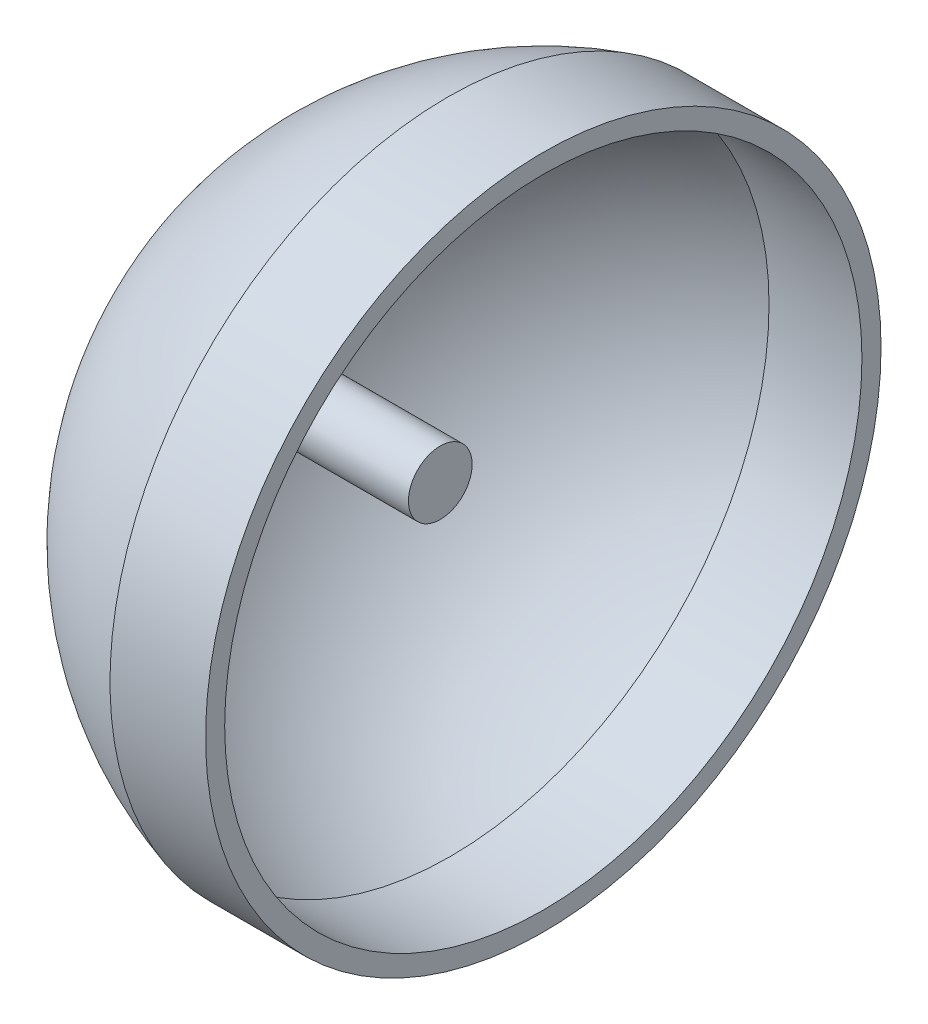
ISO-10303-21;
HEADER;
FILE_DESCRIPTION(('STEP AP214'),'2;1');
FILE_NAME('part.step','',(''),(''),'','','');
FILE_SCHEMA(('AUTOMOTIVE_DESIGN { 1 0 10303 214 1 1 1 1 }'));
ENDSEC;
DATA;
#1=APPLICATION_CONTEXT('core data for automotive mechanical design processes');
#2=APPLICATION_PROTOCOL_DEFINITION('international standard','automotive_design',2000,#1);
#3=PRODUCT_CONTEXT('',#1,'mechanical');
#4=PRODUCT('Part','Part','',(#3));
#5=PRODUCT_RELATED_PRODUCT_CATEGORY('part','',(#4));
#6=PRODUCT_DEFINITION_FORMATION('','',#4);
#7=PRODUCT_DEFINITION_CONTEXT('part definition',#1,'design');
#8=PRODUCT_DEFINITION('design','',#6,#7);
#9=PRODUCT_DEFINITION_SHAPE('','',#8);
#10=(LENGTH_UNIT() NAMED_UNIT(*) SI_UNIT(.MILLI.,.METRE.));
#11=(NAMED_UNIT(*) PLANE_ANGLE_UNIT() SI_UNIT($,.RADIAN.));
#12=(NAMED_UNIT(*) SI_UNIT($,.STERADIAN.) SOLID_ANGLE_UNIT());
#13=UNCERTAINTY_MEASURE_WITH_UNIT(LENGTH_MEASURE(1.E-05),#10,'distance_accuracy_value','');
#14=(GEOMETRIC_REPRESENTATION_CONTEXT(3) GLOBAL_UNCERTAINTY_ASSIGNED_CONTEXT((#13)) GLOBAL_UNIT_ASSIGNED_CONTEXT((#10,
#11,#12)) REPRESENTATION_CONTEXT('',''));
#15=CARTESIAN_POINT('',(0.,0.,0.));
#16=DIRECTION('',(0.,0.,1.));
#17=DIRECTION('',(1.,0.,0.));
#18=AXIS2_PLACEMENT_3D('',#15,#16,#17);
#19=CARTESIAN_POINT('',(0.,0.,0.));
#20=DIRECTION('',(1.,0.,0.));
#21=DIRECTION('',(0.,0.,-1.));
#22=AXIS2_PLACEMENT_3D('',#19,#20,#21);
#23=PLANE('',#22);
#24=CARTESIAN_POINT('',(0.,0.,0.));
#25=DIRECTION('',(1.,0.,0.));
#26=DIRECTION('',(0.,0.,-1.));
#27=AXIS2_PLACEMENT_3D('',#24,#25,#26);
#28=CIRCLE('',#27,50.);
#29=CARTESIAN_POINT('',(0.,0.,-50.));
#30=VERTEX_POINT('',#29);
#31=EDGE_CURVE('E58',#30,#30,#28,.T.);
#32=ORIENTED_EDGE('',*,*,#31,.F.);
#33=EDGE_LOOP('',(#32));
#34=FACE_BOUND('',#33,.T.);
#35=CARTESIAN_POINT('',(0.,0.,0.));
#36=DIRECTION('',(1.,0.,0.));
#37=DIRECTION('',(0.,0.,-1.));
#38=AXIS2_PLACEMENT_3D('',#35,#36,#37);
#39=CIRCLE('',#38,53.);
#40=CARTESIAN_POINT('',(0.,0.,-53.));
#41=VERTEX_POINT('',#40);
#42=EDGE_CURVE('E40',#41,#41,#39,.T.);
#43=ORIENTED_EDGE('',*,*,#42,.T.);
#44=EDGE_LOOP('',(#43));
#45=FACE_BOUND('',#44,.T.);
#46=ADVANCED_FACE('F37',(#34,#45),#23,.T.);
#47=CARTESIAN_POINT('',(0.,0.,0.));
#48=DIRECTION('',(1.,0.,0.));
#49=DIRECTION('',(0.,0.,-1.));
#50=AXIS2_PLACEMENT_3D('',#47,#48,#49);
#51=CYLINDRICAL_SURFACE('',#50,53.);
#52=CARTESIAN_POINT('',(-15.,0.,0.));
#53=DIRECTION('',(1.,0.,0.));
#54=DIRECTION('',(0.,0.,-1.));
#55=AXIS2_PLACEMENT_3D('',#52,#53,#54);
#56=CIRCLE('',#55,53.);
#57=CARTESIAN_POINT('',(-15.,53.,0.));
#58=VERTEX_POINT('',#57);
#59=EDGE_CURVE('E50',#58,#58,#56,.T.);
#60=ORIENTED_EDGE('',*,*,#59,.T.);
#61=EDGE_LOOP('',(#60));
#62=FACE_BOUND('',#61,.T.);
#63=ORIENTED_EDGE('',*,*,#42,.F.);
#64=EDGE_LOOP('',(#63));
#65=FACE_BOUND('',#64,.T.);
#66=ADVANCED_FACE('F81',(#62,#65),#51,.T.);
#67=CARTESIAN_POINT('',(0.,0.,0.));
#68=DIRECTION('',(1.,0.,0.));
#69=DIRECTION('',(0.,1.,0.));
#70=AXIS2_PLACEMENT_3D('',#67,#68,#69);
#71=SPHERICAL_SURFACE('',#70,55.0817574156816);
#72=CARTESIAN_POINT('',(-54.1664102558034,0.,0.));
#73=DIRECTION('',(1.,0.,0.));
#74=DIRECTION('',(0.,0.,-1.));
#75=AXIS2_PLACEMENT_3D('',#72,#73,#74);
#76=CIRCLE('',#75,10.);
#77=CARTESIAN_POINT('',(-54.1664102558034,10.,0.));
#78=VERTEX_POINT('',#77);
#79=EDGE_CURVE('E74',#78,#78,#76,.T.);
#80=CARTESIAN_POINT('',(-54.1664102558034,10.,0.));
#81=CARTESIAN_POINT('',(-54.0505368614668,10.6276710865457,0.));
#82=CARTESIAN_POINT('',(-53.9237442432761,11.2533260120857,0.));
#83=CARTESIAN_POINT('',(-53.6484944188,12.4998520748426,0.));
#84=CARTESIAN_POINT('',(-53.5000372125146,13.1207232120596,0.));
#85=CARTESIAN_POINT('',(-53.1816320714627,14.3569302318588,0.));
#86=CARTESIAN_POINT('',(-53.0116841366961,14.9722661144411,0.));
#87=CARTESIAN_POINT('',(-52.6505043817629,16.1966593962277,0.));
#88=CARTESIAN_POINT('',(-52.4592725615962,16.8057167954321,0.));
#89=CARTESIAN_POINT('',(-52.0557557182811,18.0168170534486,0.));
#90=CARTESIAN_POINT('',(-51.8434706951328,18.6188599122608,0.));
#91=CARTESIAN_POINT('',(-51.3981040720495,19.8152036198758,0.));
#92=CARTESIAN_POINT('',(-51.1650224721146,20.4095044686786,0.));
#93=CARTESIAN_POINT('',(-50.6783443167559,21.5896460121059,0.));
#94=CARTESIAN_POINT('',(-50.4247477613321,22.1754867067303,0.));
#95=CARTESIAN_POINT('',(-49.8973461421968,23.3380000286488,0.));
#96=CARTESIAN_POINT('',(-49.6235410784854,23.914672655943,0.));
#97=CARTESIAN_POINT('',(-49.0560532997295,25.0581530063667,0.));
#98=CARTESIAN_POINT('',(-48.7623705846851,25.6249607294963,0.));
#99=CARTESIAN_POINT('',(-48.1554823824572,26.7480263558265,0.));
#100=CARTESIAN_POINT('',(-47.8422768952736,27.304284259027,0.));
#101=CARTESIAN_POINT('',(-47.1967216180815,28.4055780777125,0.));
#102=CARTESIAN_POINT('',(-46.8643718280731,28.9506139931974,0.));
#103=CARTESIAN_POINT('',(-46.1809295482153,30.0288052290674,0.));
#104=CARTESIAN_POINT('',(-45.8298370583661,30.5619605494526,0.));
#105=CARTESIAN_POINT('',(-45.1093336299579,31.6157463439339,0.));
#106=CARTESIAN_POINT('',(-44.7399226913989,32.13637681803,0.));
#107=CARTESIAN_POINT('',(-43.9832287522583,33.1644838034493,0.));
#108=CARTESIAN_POINT('',(-43.5959457516766,33.6719603147725,0.));
#109=CARTESIAN_POINT('',(-42.8039756713145,34.6731461530717,0.));
#110=CARTESIAN_POINT('',(-42.399288591534,35.1668554800478,0.));
#111=CARTESIAN_POINT('',(-41.5729993662411,36.1399103639904,0.));
#112=CARTESIAN_POINT('',(-41.1513972207287,36.6192559209571,0.));
#113=CARTESIAN_POINT('',(-40.2917873171692,37.5630040360292,0.));
#114=CARTESIAN_POINT('',(-39.8537795591222,38.0274065941347,0.));
#115=CARTESIAN_POINT('',(-38.9618877078114,38.9407075393687,0.));
#116=CARTESIAN_POINT('',(-38.5080036145476,39.3896059264971,0.));
#117=CARTESIAN_POINT('',(-37.5849075546768,40.2713560925026,0.));
#118=CARTESIAN_POINT('',(-37.1156955880697,40.7042078713796,0.));
#119=CARTESIAN_POINT('',(-36.1625107651939,41.5533417739176,0.));
#120=CARTESIAN_POINT('',(-35.6785379089252,41.9696238975786,0.));
#121=CARTESIAN_POINT('',(-34.6964161270868,42.7851154650623,0.));
#122=CARTESIAN_POINT('',(-34.198267201517,43.1843249088849,0.));
#123=CARTESIAN_POINT('',(-33.1883952314387,43.96518872227,0.));
#124=CARTESIAN_POINT('',(-32.6766721869302,44.3468430918325,0.));
#125=CARTESIAN_POINT('',(-31.6402703319378,45.0921355753271,0.));
#126=CARTESIAN_POINT('',(-31.1155915214539,45.4557736892593,0.));
#127=CARTESIAN_POINT('',(-30.0539121429468,46.1645942506856,0.));
#128=CARTESIAN_POINT('',(-29.5169115749236,46.5097766981796,0.));
#129=CARTESIAN_POINT('',(-28.4312375788517,47.1812688165963,0.));
#130=CARTESIAN_POINT('',(-27.882564150803,47.5075784875189,0.));
#131=CARTESIAN_POINT('',(-26.7742074381902,48.1409307505691,0.));
#132=CARTESIAN_POINT('',(-26.2145241536262,48.4479733426967,0.));
#133=CARTESIAN_POINT('',(-25.0848240324884,49.0424204183287,0.));
#134=CARTESIAN_POINT('',(-24.5148071959146,49.329824901833,0.));
#135=CARTESIAN_POINT('',(-23.365128773378,49.8846484958343,0.));
#136=CARTESIAN_POINT('',(-22.7854671874153,50.1520676063312,0.));
#137=CARTESIAN_POINT('',(-21.6171996809555,50.6665972081588,0.));
#138=CARTESIAN_POINT('',(-21.0285937604584,50.9137076994895,0.));
#139=CARTESIAN_POINT('',(-19.8431489655053,51.3873218483241,0.));
#140=CARTESIAN_POINT('',(-19.2463100910492,51.6138255058281,0.));
#141=CARTESIAN_POINT('',(-18.0451201290106,52.0459508403632,0.));
#142=CARTESIAN_POINT('',(-17.4407690414282,52.2515725173944,0.));
#143=CARTESIAN_POINT('',(-16.225286666848,52.6416908175178,0.));
#144=CARTESIAN_POINT('',(-15.6141553798501,52.8261874406101,0.));
#145=CARTESIAN_POINT('',(-15.,53.,0.));
#146=B_SPLINE_CURVE_WITH_KNOTS('',3,(#80,#81,#82,#83,#84,#85,#86,#87,#88,#89,#90,#91,#92,#93,
#94,#95,#96,#97,#98,#99,#100,#101,#102,#103,#104,#105,#106,#107,#108,#109,#110,#111,#112,#113,
#114,#115,#116,#117,#118,#119,#120,#121,#122,#123,#124,#125,#126,#127,#128,#129,#130,#131,#132,
#133,#134,#135,#136,#137,#138,#139,#140,#141,#142,#143,#144,#145),.UNSPECIFIED.,.F.,.F.,(4,2,2,
2,2,2,2,2,2,2,2,2,2,2,2,2,2,2,2,2,2,2,2,2,2,2,2,2,2,2,2,2,4),(0.,1.91473434854773,
3.82946869709545,5.74420304564319,7.65893739419092,9.57367174273864,11.4884060912864,
13.4031404398341,15.3178747883818,17.2326091369296,19.1473434854773,21.062077834025,
22.9768121825727,24.8915465311205,26.8062808796682,28.7210152282159,30.6357495767637,
32.5504839253114,34.4652182738591,36.3799526224068,38.2946869709546,40.2094213195023,
42.12415566805,44.0388900165977,45.9536243651455,47.8683587136932,49.7830930622409,
51.6978274107887,53.6125617593364,55.5272961078841,57.4420304564319,59.3567648049796,
61.2714991535273),.UNSPECIFIED.);
#147=EDGE_CURVE('BSEAM84',#78,#58,#146,.T.);
#148=ORIENTED_EDGE('',*,*,#79,.T.);
#149=ORIENTED_EDGE('',*,*,#59,.F.);
#150=ORIENTED_EDGE('',*,*,#147,.T.);
#151=ORIENTED_EDGE('',*,*,#147,.F.);
#152=EDGE_LOOP('',(#148,#150,#149,#151));
#153=FACE_BOUND('',#152,.T.);
#154=ADVANCED_FACE('F84',(#153),#71,.T.);
#155=CARTESIAN_POINT('',(0.,0.,0.));
#156=DIRECTION('',(1.,0.,0.));
#157=DIRECTION('',(0.,0.,-1.));
#158=AXIS2_PLACEMENT_3D('',#155,#156,#157);
#159=CYLINDRICAL_SURFACE('',#158,10.);
#160=CARTESIAN_POINT('',(-49.1664102558034,0.,0.));
#161=DIRECTION('',(1.,0.,0.));
#162=DIRECTION('',(0.,0.,-1.));
#163=AXIS2_PLACEMENT_3D('',#160,#161,#162);
#164=CIRCLE('',#163,9.99999999999999);
#165=CARTESIAN_POINT('',(-49.1664102558034,0.,-9.99999999999999));
#166=VERTEX_POINT('',#165);
#167=EDGE_CURVE('E70',#166,#166,#164,.T.);
#168=ORIENTED_EDGE('',*,*,#167,.T.);
#169=EDGE_LOOP('',(#168));
#170=FACE_BOUND('',#169,.T.);
#171=ORIENTED_EDGE('',*,*,#79,.F.);
#172=EDGE_LOOP('',(#171));
#173=FACE_BOUND('',#172,.T.);
#174=ADVANCED_FACE('F86',(#170,#173),#159,.F.);
#175=CARTESIAN_POINT('',(-49.1664102558034,0.,0.));
#176=DIRECTION('',(-1.,0.,0.));
#177=DIRECTION('',(0.,0.,1.));
#178=AXIS2_PLACEMENT_3D('',#175,#176,#177);
#179=PLANE('',#178);
#180=ORIENTED_EDGE('',*,*,#167,.F.);
#181=EDGE_LOOP('',(#180));
#182=FACE_BOUND('',#181,.T.);
#183=ADVANCED_FACE('F93',(#182),#179,.T.);
#184=CARTESIAN_POINT('',(0.,0.,0.));
#185=DIRECTION('',(1.,0.,0.));
#186=DIRECTION('',(0.,0.,-1.));
#187=AXIS2_PLACEMENT_3D('',#184,#185,#186);
#188=CYLINDRICAL_SURFACE('',#187,50.);
#189=CARTESIAN_POINT('',(-14.5777040546826,0.,0.));
#190=DIRECTION('',(1.,0.,0.));
#191=DIRECTION('',(0.,0.,-1.));
#192=AXIS2_PLACEMENT_3D('',#189,#190,#191);
#193=CIRCLE('',#192,50.);
#194=CARTESIAN_POINT('',(-14.5777040546826,50.,0.));
#195=VERTEX_POINT('',#194);
#196=EDGE_CURVE('E54',#195,#195,#193,.T.);
#197=ORIENTED_EDGE('',*,*,#196,.F.);
#198=EDGE_LOOP('',(#197));
#199=FACE_BOUND('',#198,.T.);
#200=ORIENTED_EDGE('',*,*,#31,.T.);
#201=EDGE_LOOP('',(#200));
#202=FACE_BOUND('',#201,.T.);
#203=ADVANCED_FACE('F104',(#199,#202),#188,.F.);
#204=CARTESIAN_POINT('',(0.,0.,0.));
#205=DIRECTION('',(1.,0.,0.));
#206=DIRECTION('',(0.,1.,0.));
#207=AXIS2_PLACEMENT_3D('',#204,#205,#206);
#208=SPHERICAL_SURFACE('',#207,52.0817574156816);
#209=CARTESIAN_POINT('',(-50.4332177786219,0.,0.));
#210=DIRECTION('',(1.,0.,0.));
#211=DIRECTION('',(0.,0.,-1.));
#212=AXIS2_PLACEMENT_3D('',#209,#210,#211);
#213=CIRCLE('',#212,13.);
#214=CARTESIAN_POINT('',(-50.4332177786219,13.,0.));
#215=VERTEX_POINT('',#214);
#216=EDGE_CURVE('E59',#215,#215,#213,.T.);
#217=CARTESIAN_POINT('',(-50.4332177786219,13.,0.));
#218=CARTESIAN_POINT('',(-50.2930876840259,13.5436453108094,0.));
#219=CARTESIAN_POINT('',(-50.1441608428461,14.0850229168382,0.));
#220=CARTESIAN_POINT('',(-49.8288837671326,15.1626808124265,0.));
#221=CARTESIAN_POINT('',(-49.6625335325988,15.698961101986,0.));
#222=CARTESIAN_POINT('',(-49.3125797699902,16.7658624577274,0.));
#223=CARTESIAN_POINT('',(-49.1289762419154,17.2964835239094,0.));
#224=CARTESIAN_POINT('',(-48.7447089154272,18.3515118719753,0.));
#225=CARTESIAN_POINT('',(-48.5440451170137,18.8759191538593,0.));
#226=CARTESIAN_POINT('',(-48.1258668046336,19.9179714873822,0.));
#227=CARTESIAN_POINT('',(-47.908352290667,20.4356165390212,0.));
#228=CARTESIAN_POINT('',(-47.4567000730174,21.4636031398149,0.));
#229=CARTESIAN_POINT('',(-47.2225623693344,21.9739446889695,0.));
#230=CARTESIAN_POINT('',(-46.7379085867997,22.9867906222453,0.));
#231=CARTESIAN_POINT('',(-46.487392507948,23.4892950063666,0.));
#232=CARTESIAN_POINT('',(-45.9702439414174,24.4859411495985,0.));
#233=CARTESIAN_POINT('',(-45.7036114537386,24.9800829087092,0.));
#234=CARTESIAN_POINT('',(-45.154508881847,25.9594870846456,0.));
#235=CARTESIAN_POINT('',(-44.8720387976342,26.4447495014713,0.));
#236=CARTESIAN_POINT('',(-44.2915564079193,27.4058875610911,0.));
#237=CARTESIAN_POINT('',(-43.9935441024172,27.8817632038852,0.));
#238=CARTESIAN_POINT('',(-43.382288897159,28.8236300991668,0.));
#239=CARTESIAN_POINT('',(-43.0690459974028,29.2896213516542,0.));
#240=CARTESIAN_POINT('',(-42.4276571572129,30.2112321860486,0.));
#241=CARTESIAN_POINT('',(-42.099511216779,30.6668517679556,0.));
#242=CARTESIAN_POINT('',(-41.428659432668,31.5672428264104,0.));
#243=CARTESIAN_POINT('',(-41.0859535889909,32.0120143029582,0.));
#244=CARTESIAN_POINT('',(-40.3863403609167,32.8902440596248,0.));
#245=CARTESIAN_POINT('',(-40.0294329765195,33.3237023397436,0.));
#246=CARTESIAN_POINT('',(-39.3017898798706,34.1788524425267,0.));
#247=CARTESIAN_POINT('',(-38.9310541676187,34.600544265191,0.));
#248=CARTESIAN_POINT('',(-38.176142088208,35.4317204960535,0.));
#249=CARTESIAN_POINT('',(-37.7919657210491,35.8412049042517,0.));
#250=CARTESIAN_POINT('',(-37.0105740594692,36.6475381142861,0.));
#251=CARTESIAN_POINT('',(-36.6133587650482,37.0443869161223,0.));
#252=CARTESIAN_POINT('',(-35.8063046112059,37.825033934407,0.));
#253=CARTESIAN_POINT('',(-35.3964657517846,38.2088321508555,0.));
#254=CARTESIAN_POINT('',(-34.5645930304819,38.9629766661464,0.));
#255=CARTESIAN_POINT('',(-34.1425591686005,39.3333229649887,0.));
#256=CARTESIAN_POINT('',(-33.2867377570549,40.0601763793243,0.));
#257=CARTESIAN_POINT('',(-32.8529502073907,40.4166834948175,0.));
#258=CARTESIAN_POINT('',(-31.9740750256167,41.1154857481423,0.));
#259=CARTESIAN_POINT('',(-31.5289873935068,41.4577808859739,0.));
#260=CARTESIAN_POINT('',(-30.6279774685134,42.1278012509307,0.));
#261=CARTESIAN_POINT('',(-30.1720551756298,42.4555264780559,0.));
#262=CARTESIAN_POINT('',(-29.2498526803973,43.0960643240646,0.));
#263=CARTESIAN_POINT('',(-28.7835724780483,43.4088769429481,0.));
#264=CARTESIAN_POINT('',(-27.8411417463504,44.0192624689644,0.));
#265=CARTESIAN_POINT('',(-27.3649912170016,44.3168353760973,0.));
#266=CARTESIAN_POINT('',(-26.4033177348703,44.8964303105689,0.));
#267=CARTESIAN_POINT('',(-25.917794782088,45.1784523379077,0.));
#268=CARTESIAN_POINT('',(-24.9378841578481,45.7266506078663,0.));
#269=CARTESIAN_POINT('',(-24.4434964863907,45.9928268504861,0.));
#270=CARTESIAN_POINT('',(-23.4463733970831,46.5090552091109,0.));
#271=CARTESIAN_POINT('',(-22.943637979233,46.7591073251158,0.));
#272=CARTESIAN_POINT('',(-21.9303451066886,47.2428259743013,0.));
#273=CARTESIAN_POINT('',(-21.4197876519944,47.4764925074818,0.));
#274=CARTESIAN_POINT('',(-20.3913845642882,47.9271955759671,0.));
#275=CARTESIAN_POINT('',(-19.8735389312762,48.1442321112719,0.));
#276=CARTESIAN_POINT('',(-18.8311010801036,48.5614485058104,0.));
#277=CARTESIAN_POINT('',(-18.3065088619429,48.7616283650442,0.));
#278=CARTESIAN_POINT('',(-17.2511260648588,49.1449210605991,0.));
#279=CARTESIAN_POINT('',(-16.7203354859353,49.3280338969202,0.));
#280=CARTESIAN_POINT('',(-15.6531122541033,49.6770048811472,0.));
#281=CARTESIAN_POINT('',(-15.1166796011948,49.842863029053,0.));
#282=CARTESIAN_POINT('',(-14.5777040546826,50.,0.));
#283=B_SPLINE_CURVE_WITH_KNOTS('',3,(#217,#218,#219,#220,#221,#222,#223,#224,#225,#226,#227,
#228,#229,#230,#231,#232,#233,#234,#235,#236,#237,#238,#239,#240,#241,#242,#243,#244,#245,#246,
#247,#248,#249,#250,#251,#252,#253,#254,#255,#256,#257,#258,#259,#260,#261,#262,#263,#264,#265,
#266,#267,#268,#269,#270,#271,#272,#273,#274,#275,#276,#277,#278,#279,#280,#281,#282),
.UNSPECIFIED.,.F.,.F.,(4,2,2,2,2,2,2,2,2,2,2,2,2,2,2,2,2,2,2,2,2,2,2,2,2,2,2,2,2,2,2,2,4),(0.,
1.68417093088373,3.36834186176746,5.05251279265119,6.73668372353492,8.42085465441864,
10.1050255853024,11.7891965161861,13.4733674470698,15.1575383779536,16.8417093088373,
18.525880239721,20.2100511706047,21.8942221014885,23.5783930323722,25.2625639632559,
26.9467348941397,28.6309058250234,30.3150767559071,31.9992476867908,33.6834186176746,
35.3675895485583,37.051760479442,38.7359314103258,40.4201023412095,42.1042732720932,
43.7884442029769,45.4726151338607,47.1567860647444,48.8409569956281,50.5251279265119,
52.2092988573956,53.8934697882793),.UNSPECIFIED.);
#284=EDGE_CURVE('BSEAM106',#215,#195,#283,.T.);
#285=ORIENTED_EDGE('',*,*,#216,.F.);
#286=ORIENTED_EDGE('',*,*,#196,.T.);
#287=ORIENTED_EDGE('',*,*,#284,.T.);
#288=ORIENTED_EDGE('',*,*,#284,.F.);
#289=EDGE_LOOP('',(#285,#287,#286,#288));
#290=FACE_BOUND('',#289,.T.);
#291=ADVANCED_FACE('F106',(#290),#208,.F.);
#292=CARTESIAN_POINT('',(0.,0.,0.));
#293=DIRECTION('',(1.,0.,0.));
#294=DIRECTION('',(0.,0.,-1.));
#295=AXIS2_PLACEMENT_3D('',#292,#293,#294);
#296=CYLINDRICAL_SURFACE('',#295,13.);
#297=CARTESIAN_POINT('',(-46.1664102558034,0.,0.));
#298=DIRECTION('',(-1.,0.,0.));
#299=DIRECTION('',(0.,0.,1.));
#300=AXIS2_PLACEMENT_3D('',#297,#298,#299);
#301=CIRCLE('',#300,13.);
#302=CARTESIAN_POINT('',(-46.1664102558034,0.,13.));
#303=VERTEX_POINT('',#302);
#304=EDGE_CURVE('E63',#303,#303,#301,.F.);
#305=ORIENTED_EDGE('',*,*,#304,.F.);
#306=EDGE_LOOP('',(#305));
#307=FACE_BOUND('',#306,.T.);
#308=ORIENTED_EDGE('',*,*,#216,.T.);
#309=EDGE_LOOP('',(#308));
#310=FACE_BOUND('',#309,.T.);
#311=ADVANCED_FACE('F113',(#307,#310),#296,.T.);
#312=CARTESIAN_POINT('',(-46.1664102558034,0.,0.));
#313=DIRECTION('',(-1.,0.,0.));
#314=DIRECTION('',(0.,0.,1.));
#315=AXIS2_PLACEMENT_3D('',#312,#313,#314);
#316=PLANE('',#315);
#317=CARTESIAN_POINT('',(-46.1664102558034,0.,0.));
#318=DIRECTION('',(1.,0.,0.));
#319=DIRECTION('',(0.,0.,-1.));
#320=AXIS2_PLACEMENT_3D('',#317,#318,#319);
#321=CIRCLE('',#320,5.);
#322=CARTESIAN_POINT('',(-46.1664102558034,0.,-5.));
#323=VERTEX_POINT('',#322);
#324=EDGE_CURVE('E10',#323,#323,#321,.T.);
#325=ORIENTED_EDGE('',*,*,#324,.F.);
#326=EDGE_LOOP('',(#325));
#327=FACE_BOUND('',#326,.T.);
#328=ORIENTED_EDGE('',*,*,#304,.T.);
#329=EDGE_LOOP('',(#328));
#330=FACE_BOUND('',#329,.T.);
#331=ADVANCED_FACE('F125',(#327,#330),#316,.F.);
#332=CARTESIAN_POINT('',(-16.1664102558034,0.,0.));
#333=DIRECTION('',(-1.,0.,0.));
#334=DIRECTION('',(0.,0.,1.));
#335=AXIS2_PLACEMENT_3D('',#332,#333,#334);
#336=CYLINDRICAL_SURFACE('',#335,5.);
#337=CARTESIAN_POINT('',(-16.1664102558034,0.,0.));
#338=DIRECTION('',(1.,0.,0.));
#339=DIRECTION('',(0.,0.,-1.));
#340=AXIS2_PLACEMENT_3D('',#337,#338,#339);
#341=CIRCLE('',#340,5.);
#342=CARTESIAN_POINT('',(-16.1664102558034,0.,-5.));
#343=VERTEX_POINT('',#342);
#344=EDGE_CURVE('E53',#343,#343,#341,.T.);
#345=ORIENTED_EDGE('',*,*,#344,.F.);
#346=EDGE_LOOP('',(#345));
#347=FACE_BOUND('',#346,.T.);
#348=ORIENTED_EDGE('',*,*,#324,.T.);
#349=EDGE_LOOP('',(#348));
#350=FACE_BOUND('',#349,.T.);
#351=ADVANCED_FACE('F120',(#347,#350),#336,.T.);
#352=CARTESIAN_POINT('',(-16.1664102558034,0.,0.));
#353=DIRECTION('',(1.,0.,0.));
#354=DIRECTION('',(0.,0.,-1.));
#355=AXIS2_PLACEMENT_3D('',#352,#353,#354);
#356=PLANE('',#355);
#357=ORIENTED_EDGE('',*,*,#344,.T.);
#358=EDGE_LOOP('',(#357));
#359=FACE_BOUND('',#358,.T.);
#360=ADVANCED_FACE('F132',(#359),#356,.T.);
#361=CLOSED_SHELL('',(#46,#66,#154,#174,#183,#203,#291,#311,#331,#351,#360));
#362=MANIFOLD_SOLID_BREP('B2',#361);
#363=ADVANCED_BREP_SHAPE_REPRESENTATION('',(#18,#362),#14);
#364=SHAPE_DEFINITION_REPRESENTATION(#9,#363);
ENDSEC;
END-ISO-10303-21;
